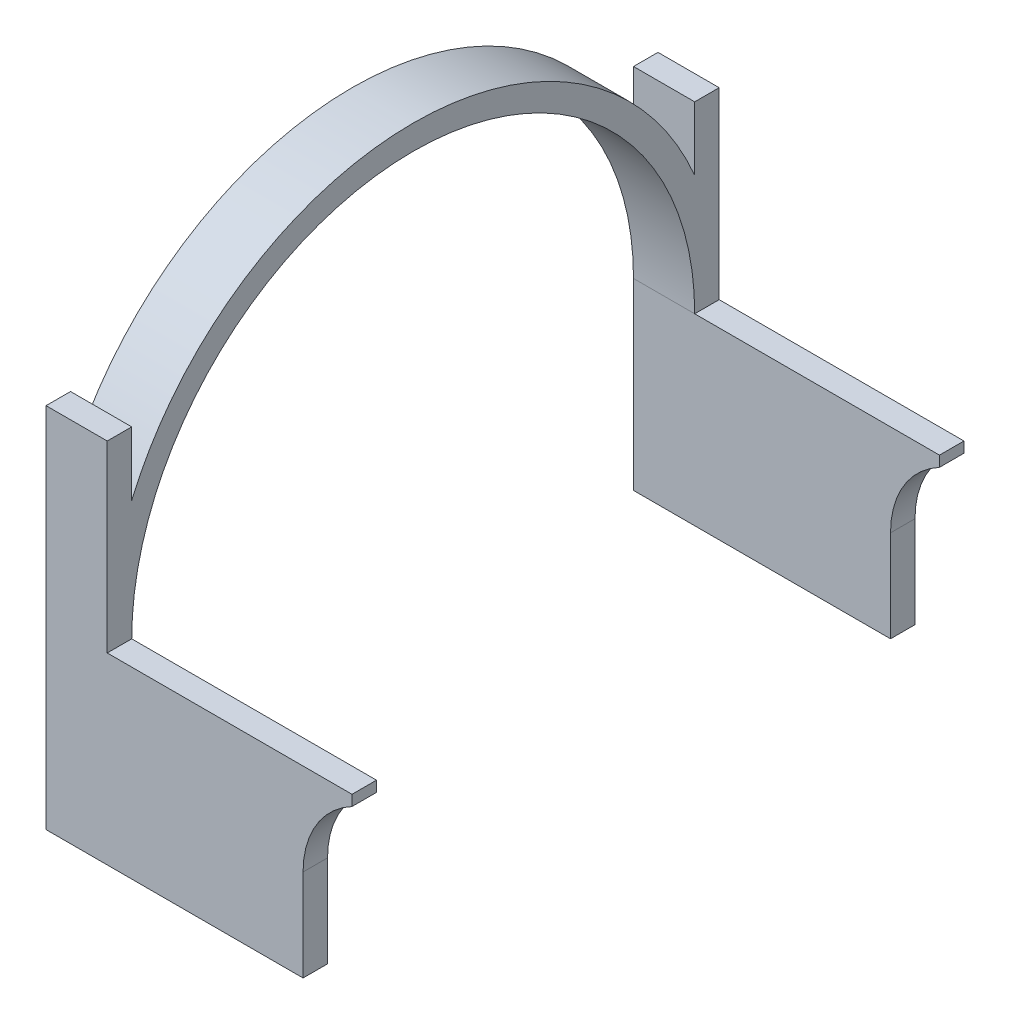
ISO-10303-21;
HEADER;
FILE_DESCRIPTION(('STEP AP214'),'2;1');
FILE_NAME('part.step','',(''),(''),'','','');
FILE_SCHEMA(('AUTOMOTIVE_DESIGN { 1 0 10303 214 1 1 1 1 }'));
ENDSEC;
DATA;
#1=APPLICATION_CONTEXT('core data for automotive mechanical design processes');
#2=APPLICATION_PROTOCOL_DEFINITION('international standard','automotive_design',2000,#1);
#3=PRODUCT_CONTEXT('',#1,'mechanical');
#4=PRODUCT('Part','Part','',(#3));
#5=PRODUCT_RELATED_PRODUCT_CATEGORY('part','',(#4));
#6=PRODUCT_DEFINITION_FORMATION('','',#4);
#7=PRODUCT_DEFINITION_CONTEXT('part definition',#1,'design');
#8=PRODUCT_DEFINITION('design','',#6,#7);
#9=PRODUCT_DEFINITION_SHAPE('','',#8);
#10=(LENGTH_UNIT() NAMED_UNIT(*) SI_UNIT(.MILLI.,.METRE.));
#11=(NAMED_UNIT(*) PLANE_ANGLE_UNIT() SI_UNIT($,.RADIAN.));
#12=(NAMED_UNIT(*) SI_UNIT($,.STERADIAN.) SOLID_ANGLE_UNIT());
#13=UNCERTAINTY_MEASURE_WITH_UNIT(LENGTH_MEASURE(1.E-05),#10,'distance_accuracy_value','');
#14=(GEOMETRIC_REPRESENTATION_CONTEXT(3) GLOBAL_UNCERTAINTY_ASSIGNED_CONTEXT((#13)) GLOBAL_UNIT_ASSIGNED_CONTEXT((#10,
#11,#12)) REPRESENTATION_CONTEXT('',''));
#15=CARTESIAN_POINT('',(0.,0.,0.));
#16=DIRECTION('',(0.,0.,1.));
#17=DIRECTION('',(1.,0.,0.));
#18=AXIS2_PLACEMENT_3D('',#15,#16,#17);
#19=CARTESIAN_POINT('',(10.,0.,0.));
#20=DIRECTION('',(1.,0.,0.));
#21=DIRECTION('',(0.,0.,-1.));
#22=AXIS2_PLACEMENT_3D('',#19,#20,#21);
#23=PLANE('',#22);
#24=CARTESIAN_POINT('',(10.,0.,0.));
#25=DIRECTION('',(-1.,0.,0.));
#26=DIRECTION('',(0.,0.,-1.));
#27=AXIS2_PLACEMENT_3D('',#24,#25,#26);
#28=CIRCLE('',#27,46.);
#29=CARTESIAN_POINT('',(10.,0.,46.));
#30=VERTEX_POINT('',#29);
#31=CARTESIAN_POINT('',(10.,0.,-46.));
#32=VERTEX_POINT('',#31);
#33=EDGE_CURVE('E280',#30,#32,#28,.T.);
#34=ORIENTED_EDGE('',*,*,#33,.T.);
#35=DIRECTION('',(0.,0.,1.));
#36=VECTOR('',#35,1.);
#37=CARTESIAN_POINT('',(10.,0.,-46.));
#38=LINE('',#37,#36);
#39=CARTESIAN_POINT('',(10.,0.,-50.));
#40=VERTEX_POINT('',#39);
#41=EDGE_CURVE('E224',#40,#32,#38,.T.);
#42=ORIENTED_EDGE('',*,*,#41,.F.);
#43=DIRECTION('',(0.,1.,0.));
#44=VECTOR('',#43,1.);
#45=CARTESIAN_POINT('',(10.,30.,-50.));
#46=LINE('',#45,#44);
#47=CARTESIAN_POINT('',(10.,30.,-50.));
#48=VERTEX_POINT('',#47);
#49=EDGE_CURVE('E284',#40,#48,#46,.T.);
#50=ORIENTED_EDGE('',*,*,#49,.T.);
#51=DIRECTION('',(0.,0.,1.));
#52=VECTOR('',#51,1.);
#53=CARTESIAN_POINT('',(10.,30.,-46.));
#54=LINE('',#53,#52);
#55=CARTESIAN_POINT('',(10.,30.,-46.));
#56=VERTEX_POINT('',#55);
#57=EDGE_CURVE('E287',#48,#56,#54,.T.);
#58=ORIENTED_EDGE('',*,*,#57,.T.);
#59=DIRECTION('',(0.,-1.,0.));
#60=VECTOR('',#59,1.);
#61=CARTESIAN_POINT('',(10.,30.,-46.));
#62=LINE('',#61,#60);
#63=CARTESIAN_POINT('',(10.,19.5959179422654,-46.));
#64=VERTEX_POINT('',#63);
#65=EDGE_CURVE('E290',#56,#64,#62,.T.);
#66=ORIENTED_EDGE('',*,*,#65,.T.);
#67=CARTESIAN_POINT('',(10.,0.,0.));
#68=DIRECTION('',(1.,0.,0.));
#69=DIRECTION('',(0.,0.,-1.));
#70=AXIS2_PLACEMENT_3D('',#67,#68,#69);
#71=CIRCLE('',#70,50.);
#72=CARTESIAN_POINT('',(10.,19.5959179422654,46.));
#73=VERTEX_POINT('',#72);
#74=EDGE_CURVE('E266',#64,#73,#71,.T.);
#75=ORIENTED_EDGE('',*,*,#74,.T.);
#76=DIRECTION('',(0.,1.,0.));
#77=VECTOR('',#76,1.);
#78=CARTESIAN_POINT('',(10.,30.,46.));
#79=LINE('',#78,#77);
#80=CARTESIAN_POINT('',(10.,30.,46.));
#81=VERTEX_POINT('',#80);
#82=EDGE_CURVE('E270',#73,#81,#79,.T.);
#83=ORIENTED_EDGE('',*,*,#82,.T.);
#84=DIRECTION('',(0.,0.,1.));
#85=VECTOR('',#84,1.);
#86=CARTESIAN_POINT('',(10.,30.,50.));
#87=LINE('',#86,#85);
#88=CARTESIAN_POINT('',(10.,30.,50.));
#89=VERTEX_POINT('',#88);
#90=EDGE_CURVE('E274',#81,#89,#87,.T.);
#91=ORIENTED_EDGE('',*,*,#90,.T.);
#92=DIRECTION('',(0.,-1.,0.));
#93=VECTOR('',#92,1.);
#94=CARTESIAN_POINT('',(10.,30.,50.));
#95=LINE('',#94,#93);
#96=CARTESIAN_POINT('',(10.,0.,50.));
#97=VERTEX_POINT('',#96);
#98=EDGE_CURVE('E277',#89,#97,#95,.T.);
#99=ORIENTED_EDGE('',*,*,#98,.T.);
#100=DIRECTION('',(0.,0.,1.));
#101=VECTOR('',#100,1.);
#102=CARTESIAN_POINT('',(10.,0.,50.));
#103=LINE('',#102,#101);
#104=EDGE_CURVE('E244',#30,#97,#103,.T.);
#105=ORIENTED_EDGE('',*,*,#104,.F.);
#106=EDGE_LOOP('',(#34,#42,#50,#58,#66,#75,#83,#91,#99,#105));
#107=FACE_BOUND('',#106,.T.);
#108=ADVANCED_FACE('F39',(#107),#23,.T.);
#109=CARTESIAN_POINT('',(10.,0.,0.));
#110=DIRECTION('',(-1.,0.,0.));
#111=DIRECTION('',(0.,0.,1.));
#112=AXIS2_PLACEMENT_3D('',#109,#110,#111);
#113=CYLINDRICAL_SURFACE('',#112,50.);
#114=CARTESIAN_POINT('',(0.,0.,0.));
#115=DIRECTION('',(1.,0.,0.));
#116=DIRECTION('',(0.,0.,-1.));
#117=AXIS2_PLACEMENT_3D('',#114,#115,#116);
#118=CIRCLE('',#117,50.);
#119=CARTESIAN_POINT('',(0.,19.5959179422654,-46.));
#120=VERTEX_POINT('',#119);
#121=CARTESIAN_POINT('',(0.,19.5959179422654,46.));
#122=VERTEX_POINT('',#121);
#123=EDGE_CURVE('E265',#120,#122,#118,.T.);
#124=ORIENTED_EDGE('',*,*,#123,.T.);
#125=DIRECTION('',(-1.,0.,0.));
#126=VECTOR('',#125,1.);
#127=CARTESIAN_POINT('',(10.,19.5959179422654,46.));
#128=LINE('',#127,#126);
#129=EDGE_CURVE('E48',#73,#122,#128,.T.);
#130=ORIENTED_EDGE('',*,*,#129,.F.);
#131=ORIENTED_EDGE('',*,*,#74,.F.);
#132=DIRECTION('',(-1.,0.,0.));
#133=VECTOR('',#132,1.);
#134=CARTESIAN_POINT('',(10.,19.5959179422654,-46.));
#135=LINE('',#134,#133);
#136=EDGE_CURVE('E293',#64,#120,#135,.T.);
#137=ORIENTED_EDGE('',*,*,#136,.T.);
#138=EDGE_LOOP('',(#124,#130,#131,#137));
#139=FACE_BOUND('',#138,.T.);
#140=ADVANCED_FACE('F41',(#139),#113,.T.);
#141=CARTESIAN_POINT('',(10.,30.,46.));
#142=DIRECTION('',(0.,0.,1.));
#143=DIRECTION('',(1.,0.,0.));
#144=AXIS2_PLACEMENT_3D('',#141,#142,#143);
#145=PLANE('',#144);
#146=DIRECTION('',(0.,1.,0.));
#147=VECTOR('',#146,1.);
#148=CARTESIAN_POINT('',(0.,30.,46.));
#149=LINE('',#148,#147);
#150=CARTESIAN_POINT('',(0.,30.,46.));
#151=VERTEX_POINT('',#150);
#152=EDGE_CURVE('E297',#122,#151,#149,.T.);
#153=ORIENTED_EDGE('',*,*,#152,.T.);
#154=DIRECTION('',(-1.,0.,0.));
#155=VECTOR('',#154,1.);
#156=CARTESIAN_POINT('',(10.,30.,46.));
#157=LINE('',#156,#155);
#158=EDGE_CURVE('E366',#81,#151,#157,.T.);
#159=ORIENTED_EDGE('',*,*,#158,.F.);
#160=ORIENTED_EDGE('',*,*,#82,.F.);
#161=ORIENTED_EDGE('',*,*,#129,.T.);
#162=EDGE_LOOP('',(#153,#159,#160,#161));
#163=FACE_BOUND('',#162,.T.);
#164=ADVANCED_FACE('F373',(#163),#145,.F.);
#165=CARTESIAN_POINT('',(10.,30.,50.));
#166=DIRECTION('',(0.,-1.,0.));
#167=DIRECTION('',(0.,0.,-1.));
#168=AXIS2_PLACEMENT_3D('',#165,#166,#167);
#169=PLANE('',#168);
#170=DIRECTION('',(0.,0.,1.));
#171=VECTOR('',#170,1.);
#172=CARTESIAN_POINT('',(0.,30.,50.));
#173=LINE('',#172,#171);
#174=CARTESIAN_POINT('',(0.,30.,50.));
#175=VERTEX_POINT('',#174);
#176=EDGE_CURVE('E300',#151,#175,#173,.T.);
#177=ORIENTED_EDGE('',*,*,#176,.T.);
#178=DIRECTION('',(-1.,0.,0.));
#179=VECTOR('',#178,1.);
#180=CARTESIAN_POINT('',(10.,30.,50.));
#181=LINE('',#180,#179);
#182=EDGE_CURVE('E362',#89,#175,#181,.T.);
#183=ORIENTED_EDGE('',*,*,#182,.F.);
#184=ORIENTED_EDGE('',*,*,#90,.F.);
#185=ORIENTED_EDGE('',*,*,#158,.T.);
#186=EDGE_LOOP('',(#177,#183,#184,#185));
#187=FACE_BOUND('',#186,.T.);
#188=ADVANCED_FACE('F388',(#187),#169,.F.);
#189=CARTESIAN_POINT('',(10.,30.,50.));
#190=DIRECTION('',(0.,0.,-1.));
#191=DIRECTION('',(0.,1.,0.));
#192=AXIS2_PLACEMENT_3D('',#189,#190,#191);
#193=PLANE('',#192);
#194=DIRECTION('',(0.,1.,0.));
#195=VECTOR('',#194,1.);
#196=CARTESIAN_POINT('',(42.,-15.,50.));
#197=LINE('',#196,#195);
#198=CARTESIAN_POINT('',(42.,-30.,50.));
#199=VERTEX_POINT('',#198);
#200=CARTESIAN_POINT('',(42.,-15.,50.));
#201=VERTEX_POINT('',#200);
#202=EDGE_CURVE('E173',#199,#201,#197,.T.);
#203=ORIENTED_EDGE('',*,*,#202,.T.);
#204=CARTESIAN_POINT('',(57.,-15.,50.));
#205=DIRECTION('',(0.,0.,-1.));
#206=DIRECTION('',(0.,1.,0.));
#207=AXIS2_PLACEMENT_3D('',#204,#205,#206);
#208=CIRCLE('',#207,15.);
#209=CARTESIAN_POINT('',(50.,-1.73350083857841,50.));
#210=VERTEX_POINT('',#209);
#211=EDGE_CURVE('E182',#201,#210,#208,.T.);
#212=ORIENTED_EDGE('',*,*,#211,.T.);
#213=DIRECTION('',(0.,-1.,0.));
#214=VECTOR('',#213,1.);
#215=CARTESIAN_POINT('',(50.,-30.,50.));
#216=LINE('',#215,#214);
#217=CARTESIAN_POINT('',(50.,0.,50.));
#218=VERTEX_POINT('',#217);
#219=EDGE_CURVE('E245',#218,#210,#216,.T.);
#220=ORIENTED_EDGE('',*,*,#219,.F.);
#221=DIRECTION('',(-1.,0.,0.));
#222=VECTOR('',#221,1.);
#223=CARTESIAN_POINT('',(50.,0.,50.));
#224=LINE('',#223,#222);
#225=EDGE_CURVE('E254',#218,#97,#224,.T.);
#226=ORIENTED_EDGE('',*,*,#225,.T.);
#227=ORIENTED_EDGE('',*,*,#98,.F.);
#228=ORIENTED_EDGE('',*,*,#182,.T.);
#229=DIRECTION('',(0.,-1.,0.));
#230=VECTOR('',#229,1.);
#231=CARTESIAN_POINT('',(0.,30.,50.));
#232=LINE('',#231,#230);
#233=CARTESIAN_POINT('',(0.,-30.,50.));
#234=VERTEX_POINT('',#233);
#235=EDGE_CURVE('E303',#175,#234,#232,.T.);
#236=ORIENTED_EDGE('',*,*,#235,.T.);
#237=DIRECTION('',(-1.,0.,0.));
#238=VECTOR('',#237,1.);
#239=CARTESIAN_POINT('',(10.,-30.,50.));
#240=LINE('',#239,#238);
#241=EDGE_CURVE('E194',#199,#234,#240,.T.);
#242=ORIENTED_EDGE('',*,*,#241,.F.);
#243=EDGE_LOOP('',(#203,#212,#220,#226,#227,#228,#236,#242));
#244=FACE_BOUND('',#243,.T.);
#245=ADVANCED_FACE('F192',(#244),#193,.F.);
#246=CARTESIAN_POINT('',(10.,-30.,50.));
#247=DIRECTION('',(0.,1.,0.));
#248=DIRECTION('',(0.,0.,1.));
#249=AXIS2_PLACEMENT_3D('',#246,#247,#248);
#250=PLANE('',#249);
#251=DIRECTION('',(-1.,0.,0.));
#252=VECTOR('',#251,1.);
#253=CARTESIAN_POINT('',(10.,-30.,46.));
#254=LINE('',#253,#252);
#255=CARTESIAN_POINT('',(42.,-30.,46.));
#256=VERTEX_POINT('',#255);
#257=CARTESIAN_POINT('',(0.,-30.,46.));
#258=VERTEX_POINT('',#257);
#259=EDGE_CURVE('E357',#256,#258,#254,.T.);
#260=ORIENTED_EDGE('',*,*,#259,.F.);
#261=DIRECTION('',(0.,0.,1.));
#262=VECTOR('',#261,1.);
#263=CARTESIAN_POINT('',(42.,-30.,50.));
#264=LINE('',#263,#262);
#265=EDGE_CURVE('E221',#256,#199,#264,.T.);
#266=ORIENTED_EDGE('',*,*,#265,.T.);
#267=ORIENTED_EDGE('',*,*,#241,.T.);
#268=DIRECTION('',(0.,0.,-1.));
#269=VECTOR('',#268,1.);
#270=CARTESIAN_POINT('',(0.,-30.,50.));
#271=LINE('',#270,#269);
#272=EDGE_CURVE('E306',#234,#258,#271,.T.);
#273=ORIENTED_EDGE('',*,*,#272,.T.);
#274=EDGE_LOOP('',(#260,#266,#267,#273));
#275=FACE_BOUND('',#274,.T.);
#276=ADVANCED_FACE('F488',(#275),#250,.F.);
#277=CARTESIAN_POINT('',(10.,0.,46.));
#278=DIRECTION('',(0.,0.,1.));
#279=DIRECTION('',(1.,0.,0.));
#280=AXIS2_PLACEMENT_3D('',#277,#278,#279);
#281=PLANE('',#280);
#282=DIRECTION('',(0.,1.,0.));
#283=VECTOR('',#282,1.);
#284=CARTESIAN_POINT('',(50.,-30.,46.));
#285=LINE('',#284,#283);
#286=CARTESIAN_POINT('',(50.,-1.73350083857841,46.));
#287=VERTEX_POINT('',#286);
#288=CARTESIAN_POINT('',(50.,0.,46.));
#289=VERTEX_POINT('',#288);
#290=EDGE_CURVE('E248',#287,#289,#285,.T.);
#291=ORIENTED_EDGE('',*,*,#290,.F.);
#292=CARTESIAN_POINT('',(57.,-15.,46.));
#293=DIRECTION('',(0.,0.,1.));
#294=DIRECTION('',(1.,0.,0.));
#295=AXIS2_PLACEMENT_3D('',#292,#293,#294);
#296=CIRCLE('',#295,15.);
#297=CARTESIAN_POINT('',(42.,-15.,46.));
#298=VERTEX_POINT('',#297);
#299=EDGE_CURVE('E55',#287,#298,#296,.T.);
#300=ORIENTED_EDGE('',*,*,#299,.T.);
#301=DIRECTION('',(0.,-1.,0.));
#302=VECTOR('',#301,1.);
#303=CARTESIAN_POINT('',(42.,0.,46.));
#304=LINE('',#303,#302);
#305=EDGE_CURVE('E176',#298,#256,#304,.T.);
#306=ORIENTED_EDGE('',*,*,#305,.T.);
#307=ORIENTED_EDGE('',*,*,#259,.T.);
#308=DIRECTION('',(0.,1.,0.));
#309=VECTOR('',#308,1.);
#310=CARTESIAN_POINT('',(0.,0.,46.));
#311=LINE('',#310,#309);
#312=CARTESIAN_POINT('',(0.,0.,46.));
#313=VERTEX_POINT('',#312);
#314=EDGE_CURVE('E310',#258,#313,#311,.T.);
#315=ORIENTED_EDGE('',*,*,#314,.T.);
#316=DIRECTION('',(-1.,0.,0.));
#317=VECTOR('',#316,1.);
#318=CARTESIAN_POINT('',(10.,0.,46.));
#319=LINE('',#318,#317);
#320=EDGE_CURVE('E353',#30,#313,#319,.T.);
#321=ORIENTED_EDGE('',*,*,#320,.F.);
#322=DIRECTION('',(-1.,0.,0.));
#323=VECTOR('',#322,1.);
#324=CARTESIAN_POINT('',(50.,0.,46.));
#325=LINE('',#324,#323);
#326=EDGE_CURVE('E261',#289,#30,#325,.T.);
#327=ORIENTED_EDGE('',*,*,#326,.F.);
#328=EDGE_LOOP('',(#291,#300,#306,#307,#315,#321,#327));
#329=FACE_BOUND('',#328,.T.);
#330=ADVANCED_FACE('F400',(#329),#281,.F.);
#331=CARTESIAN_POINT('',(10.,0.,0.));
#332=DIRECTION('',(-1.,0.,0.));
#333=DIRECTION('',(0.,0.,1.));
#334=AXIS2_PLACEMENT_3D('',#331,#332,#333);
#335=CYLINDRICAL_SURFACE('',#334,46.);
#336=CARTESIAN_POINT('',(0.,0.,0.));
#337=DIRECTION('',(-1.,0.,0.));
#338=DIRECTION('',(0.,0.,-1.));
#339=AXIS2_PLACEMENT_3D('',#336,#337,#338);
#340=CIRCLE('',#339,46.);
#341=CARTESIAN_POINT('',(0.,0.,-46.));
#342=VERTEX_POINT('',#341);
#343=EDGE_CURVE('E313',#313,#342,#340,.T.);
#344=ORIENTED_EDGE('',*,*,#343,.T.);
#345=DIRECTION('',(-1.,0.,0.));
#346=VECTOR('',#345,1.);
#347=CARTESIAN_POINT('',(10.,0.,-46.));
#348=LINE('',#347,#346);
#349=EDGE_CURVE('E349',#32,#342,#348,.T.);
#350=ORIENTED_EDGE('',*,*,#349,.F.);
#351=ORIENTED_EDGE('',*,*,#33,.F.);
#352=ORIENTED_EDGE('',*,*,#320,.T.);
#353=EDGE_LOOP('',(#344,#350,#351,#352));
#354=FACE_BOUND('',#353,.T.);
#355=ADVANCED_FACE('F406',(#354),#335,.F.);
#356=CARTESIAN_POINT('',(10.,0.,-46.));
#357=DIRECTION('',(0.,0.,-1.));
#358=DIRECTION('',(0.,1.,0.));
#359=AXIS2_PLACEMENT_3D('',#356,#357,#358);
#360=PLANE('',#359);
#361=DIRECTION('',(0.,1.,0.));
#362=VECTOR('',#361,1.);
#363=CARTESIAN_POINT('',(42.,0.,-46.));
#364=LINE('',#363,#362);
#365=CARTESIAN_POINT('',(42.,-30.,-46.));
#366=VERTEX_POINT('',#365);
#367=CARTESIAN_POINT('',(42.,-15.,-46.));
#368=VERTEX_POINT('',#367);
#369=EDGE_CURVE('E215',#366,#368,#364,.T.);
#370=ORIENTED_EDGE('',*,*,#369,.T.);
#371=CARTESIAN_POINT('',(57.,-15.,-46.));
#372=DIRECTION('',(0.,0.,-1.));
#373=DIRECTION('',(0.,1.,0.));
#374=AXIS2_PLACEMENT_3D('',#371,#372,#373);
#375=CIRCLE('',#374,15.);
#376=CARTESIAN_POINT('',(50.,-1.7335008385784,-46.));
#377=VERTEX_POINT('',#376);
#378=EDGE_CURVE('E178',#368,#377,#375,.T.);
#379=ORIENTED_EDGE('',*,*,#378,.T.);
#380=DIRECTION('',(0.,-1.,0.));
#381=VECTOR('',#380,1.);
#382=CARTESIAN_POINT('',(50.,-30.,-46.));
#383=LINE('',#382,#381);
#384=CARTESIAN_POINT('',(50.,0.,-46.));
#385=VERTEX_POINT('',#384);
#386=EDGE_CURVE('E225',#385,#377,#383,.T.);
#387=ORIENTED_EDGE('',*,*,#386,.F.);
#388=DIRECTION('',(-1.,0.,0.));
#389=VECTOR('',#388,1.);
#390=CARTESIAN_POINT('',(50.,0.,-46.));
#391=LINE('',#390,#389);
#392=EDGE_CURVE('E235',#385,#32,#391,.T.);
#393=ORIENTED_EDGE('',*,*,#392,.T.);
#394=ORIENTED_EDGE('',*,*,#349,.T.);
#395=DIRECTION('',(0.,-1.,0.));
#396=VECTOR('',#395,1.);
#397=CARTESIAN_POINT('',(0.,0.,-46.));
#398=LINE('',#397,#396);
#399=CARTESIAN_POINT('',(0.,-30.,-46.));
#400=VERTEX_POINT('',#399);
#401=EDGE_CURVE('E316',#342,#400,#398,.T.);
#402=ORIENTED_EDGE('',*,*,#401,.T.);
#403=DIRECTION('',(-1.,0.,0.));
#404=VECTOR('',#403,1.);
#405=CARTESIAN_POINT('',(10.,-30.,-46.));
#406=LINE('',#405,#404);
#407=EDGE_CURVE('E346',#366,#400,#406,.T.);
#408=ORIENTED_EDGE('',*,*,#407,.F.);
#409=EDGE_LOOP('',(#370,#379,#387,#393,#394,#402,#408));
#410=FACE_BOUND('',#409,.T.);
#411=ADVANCED_FACE('F475',(#410),#360,.F.);
#412=CARTESIAN_POINT('',(10.,-30.,-46.));
#413=DIRECTION('',(0.,1.,0.));
#414=DIRECTION('',(0.,0.,1.));
#415=AXIS2_PLACEMENT_3D('',#412,#413,#414);
#416=PLANE('',#415);
#417=DIRECTION('',(-1.,0.,0.));
#418=VECTOR('',#417,1.);
#419=CARTESIAN_POINT('',(10.,-30.,-50.));
#420=LINE('',#419,#418);
#421=CARTESIAN_POINT('',(42.,-30.,-50.));
#422=VERTEX_POINT('',#421);
#423=CARTESIAN_POINT('',(0.,-30.,-50.));
#424=VERTEX_POINT('',#423);
#425=EDGE_CURVE('E343',#422,#424,#420,.T.);
#426=ORIENTED_EDGE('',*,*,#425,.F.);
#427=DIRECTION('',(0.,0.,1.));
#428=VECTOR('',#427,1.);
#429=CARTESIAN_POINT('',(42.,-30.,-46.));
#430=LINE('',#429,#428);
#431=EDGE_CURVE('E211',#422,#366,#430,.T.);
#432=ORIENTED_EDGE('',*,*,#431,.T.);
#433=ORIENTED_EDGE('',*,*,#407,.T.);
#434=DIRECTION('',(0.,0.,-1.));
#435=VECTOR('',#434,1.);
#436=CARTESIAN_POINT('',(0.,-30.,-46.));
#437=LINE('',#436,#435);
#438=EDGE_CURVE('E320',#400,#424,#437,.T.);
#439=ORIENTED_EDGE('',*,*,#438,.T.);
#440=EDGE_LOOP('',(#426,#432,#433,#439));
#441=FACE_BOUND('',#440,.T.);
#442=ADVANCED_FACE('F471',(#441),#416,.F.);
#443=CARTESIAN_POINT('',(10.,30.,-50.));
#444=DIRECTION('',(0.,0.,1.));
#445=DIRECTION('',(0.,-1.,0.));
#446=AXIS2_PLACEMENT_3D('',#443,#444,#445);
#447=PLANE('',#446);
#448=DIRECTION('',(0.,1.,0.));
#449=VECTOR('',#448,1.);
#450=CARTESIAN_POINT('',(50.,-30.,-50.));
#451=LINE('',#450,#449);
#452=CARTESIAN_POINT('',(50.,-1.7335008385784,-50.));
#453=VERTEX_POINT('',#452);
#454=CARTESIAN_POINT('',(50.,0.,-50.));
#455=VERTEX_POINT('',#454);
#456=EDGE_CURVE('E229',#453,#455,#451,.T.);
#457=ORIENTED_EDGE('',*,*,#456,.F.);
#458=CARTESIAN_POINT('',(57.,-15.,-50.));
#459=DIRECTION('',(0.,0.,-1.));
#460=DIRECTION('',(0.,1.,0.));
#461=AXIS2_PLACEMENT_3D('',#458,#459,#460);
#462=CIRCLE('',#461,15.);
#463=CARTESIAN_POINT('',(42.,-15.,-50.));
#464=VERTEX_POINT('',#463);
#465=EDGE_CURVE('E63',#464,#453,#462,.T.);
#466=ORIENTED_EDGE('',*,*,#465,.F.);
#467=DIRECTION('',(0.,1.,0.));
#468=VECTOR('',#467,1.);
#469=CARTESIAN_POINT('',(42.,-15.,-50.));
#470=LINE('',#469,#468);
#471=EDGE_CURVE('E189',#422,#464,#470,.T.);
#472=ORIENTED_EDGE('',*,*,#471,.F.);
#473=ORIENTED_EDGE('',*,*,#425,.T.);
#474=DIRECTION('',(0.,1.,0.));
#475=VECTOR('',#474,1.);
#476=CARTESIAN_POINT('',(0.,30.,-50.));
#477=LINE('',#476,#475);
#478=CARTESIAN_POINT('',(0.,30.,-50.));
#479=VERTEX_POINT('',#478);
#480=EDGE_CURVE('E324',#424,#479,#477,.T.);
#481=ORIENTED_EDGE('',*,*,#480,.T.);
#482=DIRECTION('',(-1.,0.,0.));
#483=VECTOR('',#482,1.);
#484=CARTESIAN_POINT('',(10.,30.,-50.));
#485=LINE('',#484,#483);
#486=EDGE_CURVE('E339',#48,#479,#485,.T.);
#487=ORIENTED_EDGE('',*,*,#486,.F.);
#488=ORIENTED_EDGE('',*,*,#49,.F.);
#489=DIRECTION('',(-1.,0.,0.));
#490=VECTOR('',#489,1.);
#491=CARTESIAN_POINT('',(50.,0.,-50.));
#492=LINE('',#491,#490);
#493=EDGE_CURVE('E241',#455,#40,#492,.T.);
#494=ORIENTED_EDGE('',*,*,#493,.F.);
#495=EDGE_LOOP('',(#457,#466,#472,#473,#481,#487,#488,#494));
#496=FACE_BOUND('',#495,.T.);
#497=ADVANCED_FACE('F415',(#496),#447,.F.);
#498=CARTESIAN_POINT('',(10.,30.,-46.));
#499=DIRECTION('',(0.,-1.,0.));
#500=DIRECTION('',(0.,0.,-1.));
#501=AXIS2_PLACEMENT_3D('',#498,#499,#500);
#502=PLANE('',#501);
#503=DIRECTION('',(0.,0.,1.));
#504=VECTOR('',#503,1.);
#505=CARTESIAN_POINT('',(0.,30.,-46.));
#506=LINE('',#505,#504);
#507=CARTESIAN_POINT('',(0.,30.,-46.));
#508=VERTEX_POINT('',#507);
#509=EDGE_CURVE('E327',#479,#508,#506,.T.);
#510=ORIENTED_EDGE('',*,*,#509,.T.);
#511=DIRECTION('',(-1.,0.,0.));
#512=VECTOR('',#511,1.);
#513=CARTESIAN_POINT('',(10.,30.,-46.));
#514=LINE('',#513,#512);
#515=EDGE_CURVE('E335',#56,#508,#514,.T.);
#516=ORIENTED_EDGE('',*,*,#515,.F.);
#517=ORIENTED_EDGE('',*,*,#57,.F.);
#518=ORIENTED_EDGE('',*,*,#486,.T.);
#519=EDGE_LOOP('',(#510,#516,#517,#518));
#520=FACE_BOUND('',#519,.T.);
#521=ADVANCED_FACE('F421',(#520),#502,.F.);
#522=CARTESIAN_POINT('',(10.,30.,-46.));
#523=DIRECTION('',(0.,0.,-1.));
#524=DIRECTION('',(-1.,0.,0.));
#525=AXIS2_PLACEMENT_3D('',#522,#523,#524);
#526=PLANE('',#525);
#527=DIRECTION('',(0.,-1.,0.));
#528=VECTOR('',#527,1.);
#529=CARTESIAN_POINT('',(0.,30.,-46.));
#530=LINE('',#529,#528);
#531=EDGE_CURVE('E271',#508,#120,#530,.T.);
#532=ORIENTED_EDGE('',*,*,#531,.T.);
#533=ORIENTED_EDGE('',*,*,#136,.F.);
#534=ORIENTED_EDGE('',*,*,#65,.F.);
#535=ORIENTED_EDGE('',*,*,#515,.T.);
#536=EDGE_LOOP('',(#532,#533,#534,#535));
#537=FACE_BOUND('',#536,.T.);
#538=ADVANCED_FACE('F424',(#537),#526,.F.);
#539=CARTESIAN_POINT('',(0.,0.,0.));
#540=DIRECTION('',(1.,0.,0.));
#541=DIRECTION('',(0.,0.,-1.));
#542=AXIS2_PLACEMENT_3D('',#539,#540,#541);
#543=PLANE('',#542);
#544=ORIENTED_EDGE('',*,*,#123,.F.);
#545=ORIENTED_EDGE('',*,*,#531,.F.);
#546=ORIENTED_EDGE('',*,*,#509,.F.);
#547=ORIENTED_EDGE('',*,*,#480,.F.);
#548=ORIENTED_EDGE('',*,*,#438,.F.);
#549=ORIENTED_EDGE('',*,*,#401,.F.);
#550=ORIENTED_EDGE('',*,*,#343,.F.);
#551=ORIENTED_EDGE('',*,*,#314,.F.);
#552=ORIENTED_EDGE('',*,*,#272,.F.);
#553=ORIENTED_EDGE('',*,*,#235,.F.);
#554=ORIENTED_EDGE('',*,*,#176,.F.);
#555=ORIENTED_EDGE('',*,*,#152,.F.);
#556=EDGE_LOOP('',(#544,#545,#546,#547,#548,#549,#550,#551,#552,#553,#554,#555));
#557=FACE_BOUND('',#556,.T.);
#558=ADVANCED_FACE('F381',(#557),#543,.F.);
#559=CARTESIAN_POINT('',(50.,0.,50.));
#560=DIRECTION('',(0.,-1.,0.));
#561=DIRECTION('',(0.,0.,-1.));
#562=AXIS2_PLACEMENT_3D('',#559,#560,#561);
#563=PLANE('',#562);
#564=ORIENTED_EDGE('',*,*,#104,.T.);
#565=ORIENTED_EDGE('',*,*,#225,.F.);
#566=DIRECTION('',(0.,0.,1.));
#567=VECTOR('',#566,1.);
#568=CARTESIAN_POINT('',(50.,0.,50.));
#569=LINE('',#568,#567);
#570=EDGE_CURVE('E251',#289,#218,#569,.T.);
#571=ORIENTED_EDGE('',*,*,#570,.F.);
#572=ORIENTED_EDGE('',*,*,#326,.T.);
#573=EDGE_LOOP('',(#564,#565,#571,#572));
#574=FACE_BOUND('',#573,.T.);
#575=ADVANCED_FACE('F395',(#574),#563,.F.);
#576=CARTESIAN_POINT('',(50.,0.,0.));
#577=DIRECTION('',(-1.,0.,0.));
#578=DIRECTION('',(0.,0.,1.));
#579=AXIS2_PLACEMENT_3D('',#576,#577,#578);
#580=PLANE('',#579);
#581=ORIENTED_EDGE('',*,*,#219,.T.);
#582=DIRECTION('',(0.,0.,-1.));
#583=VECTOR('',#582,1.);
#584=CARTESIAN_POINT('',(50.,-1.73350083857841,50.));
#585=LINE('',#584,#583);
#586=EDGE_CURVE('E184',#210,#287,#585,.T.);
#587=ORIENTED_EDGE('',*,*,#586,.T.);
#588=ORIENTED_EDGE('',*,*,#290,.T.);
#589=ORIENTED_EDGE('',*,*,#570,.T.);
#590=EDGE_LOOP('',(#581,#587,#588,#589));
#591=FACE_BOUND('',#590,.T.);
#592=ADVANCED_FACE('F443',(#591),#580,.F.);
#593=CARTESIAN_POINT('',(50.,0.,-46.));
#594=DIRECTION('',(0.,-1.,0.));
#595=DIRECTION('',(0.,0.,-1.));
#596=AXIS2_PLACEMENT_3D('',#593,#594,#595);
#597=PLANE('',#596);
#598=ORIENTED_EDGE('',*,*,#41,.T.);
#599=ORIENTED_EDGE('',*,*,#392,.F.);
#600=DIRECTION('',(0.,0.,1.));
#601=VECTOR('',#600,1.);
#602=CARTESIAN_POINT('',(50.,0.,-46.));
#603=LINE('',#602,#601);
#604=EDGE_CURVE('E232',#455,#385,#603,.T.);
#605=ORIENTED_EDGE('',*,*,#604,.F.);
#606=ORIENTED_EDGE('',*,*,#493,.T.);
#607=EDGE_LOOP('',(#598,#599,#605,#606));
#608=FACE_BOUND('',#607,.T.);
#609=ADVANCED_FACE('F446',(#608),#597,.F.);
#610=CARTESIAN_POINT('',(50.,0.,0.));
#611=DIRECTION('',(-1.,0.,0.));
#612=DIRECTION('',(0.,0.,1.));
#613=AXIS2_PLACEMENT_3D('',#610,#611,#612);
#614=PLANE('',#613);
#615=ORIENTED_EDGE('',*,*,#386,.T.);
#616=DIRECTION('',(0.,0.,-1.));
#617=VECTOR('',#616,1.);
#618=CARTESIAN_POINT('',(50.,-1.73350083857841,50.));
#619=LINE('',#618,#617);
#620=EDGE_CURVE('E11',#377,#453,#619,.T.);
#621=ORIENTED_EDGE('',*,*,#620,.T.);
#622=ORIENTED_EDGE('',*,*,#456,.T.);
#623=ORIENTED_EDGE('',*,*,#604,.T.);
#624=EDGE_LOOP('',(#615,#621,#622,#623));
#625=FACE_BOUND('',#624,.T.);
#626=ADVANCED_FACE('F450',(#625),#614,.F.);
#627=CARTESIAN_POINT('',(57.,-15.,50.));
#628=DIRECTION('',(0.,0.,-1.));
#629=DIRECTION('',(0.,1.,0.));
#630=AXIS2_PLACEMENT_3D('',#627,#628,#629);
#631=CYLINDRICAL_SURFACE('',#630,15.);
#632=DIRECTION('',(0.,0.,-1.));
#633=VECTOR('',#632,1.);
#634=CARTESIAN_POINT('',(42.,-15.,50.));
#635=LINE('',#634,#633);
#636=EDGE_CURVE('E179',#368,#464,#635,.T.);
#637=ORIENTED_EDGE('',*,*,#636,.T.);
#638=ORIENTED_EDGE('',*,*,#465,.T.);
#639=ORIENTED_EDGE('',*,*,#620,.F.);
#640=ORIENTED_EDGE('',*,*,#378,.F.);
#641=EDGE_LOOP('',(#637,#638,#639,#640));
#642=FACE_BOUND('',#641,.T.);
#643=ADVANCED_FACE('F453',(#642),#631,.F.);
#644=CARTESIAN_POINT('',(42.,-15.,50.));
#645=DIRECTION('',(-1.,0.,0.));
#646=DIRECTION('',(0.,0.,1.));
#647=AXIS2_PLACEMENT_3D('',#644,#645,#646);
#648=PLANE('',#647);
#649=ORIENTED_EDGE('',*,*,#431,.F.);
#650=ORIENTED_EDGE('',*,*,#471,.T.);
#651=ORIENTED_EDGE('',*,*,#636,.F.);
#652=ORIENTED_EDGE('',*,*,#369,.F.);
#653=EDGE_LOOP('',(#649,#650,#651,#652));
#654=FACE_BOUND('',#653,.T.);
#655=ADVANCED_FACE('F458',(#654),#648,.F.);
#656=ORIENTED_EDGE('',*,*,#305,.F.);
#657=EDGE_CURVE('E169',#201,#298,#635,.T.);
#658=ORIENTED_EDGE('',*,*,#657,.F.);
#659=ORIENTED_EDGE('',*,*,#202,.F.);
#660=ORIENTED_EDGE('',*,*,#265,.F.);
#661=EDGE_LOOP('',(#656,#658,#659,#660));
#662=FACE_BOUND('',#661,.T.);
#663=ADVANCED_FACE('F171',(#662),#648,.F.);
#664=ORIENTED_EDGE('',*,*,#586,.F.);
#665=ORIENTED_EDGE('',*,*,#211,.F.);
#666=ORIENTED_EDGE('',*,*,#657,.T.);
#667=ORIENTED_EDGE('',*,*,#299,.F.);
#668=EDGE_LOOP('',(#664,#665,#666,#667));
#669=FACE_BOUND('',#668,.T.);
#670=ADVANCED_FACE('F183',(#669),#631,.F.);
#671=CLOSED_SHELL('',(#108,#140,#164,#188,#245,#276,#330,#355,#411,#442,#497,#521,#538,#558,
#575,#592,#609,#626,#643,#655,#663,#670));
#672=MANIFOLD_SOLID_BREP('B2',#671);
#673=ADVANCED_BREP_SHAPE_REPRESENTATION('',(#18,#672),#14);
#674=SHAPE_DEFINITION_REPRESENTATION(#9,#673);
ENDSEC;
END-ISO-10303-21;
